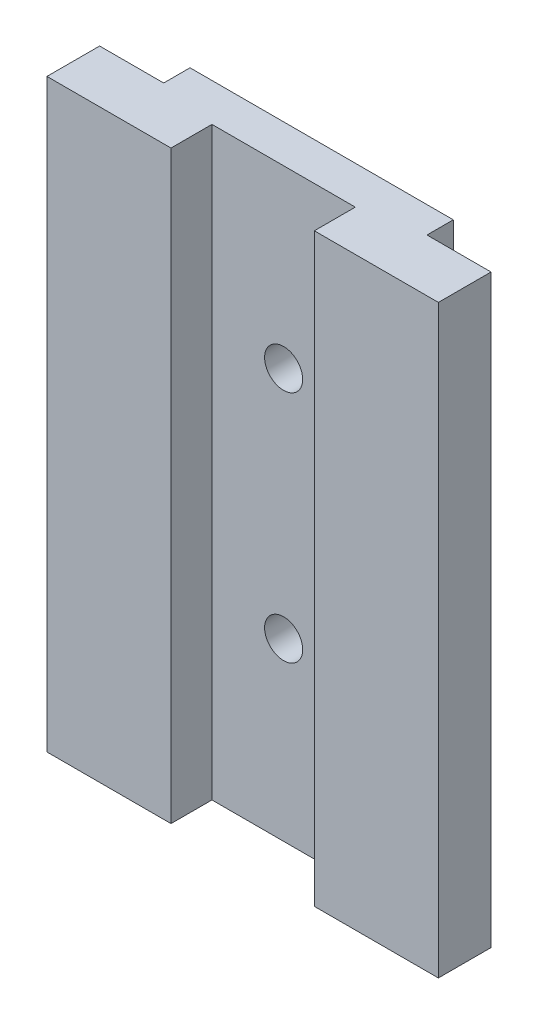
ISO-10303-21;
HEADER;
FILE_DESCRIPTION(('STEP AP214'),'2;1');
FILE_NAME('part.step','',(''),(''),'','','');
FILE_SCHEMA(('AUTOMOTIVE_DESIGN { 1 0 10303 214 1 1 1 1 }'));
ENDSEC;
DATA;
#1=APPLICATION_CONTEXT('core data for automotive mechanical design processes');
#2=APPLICATION_PROTOCOL_DEFINITION('international standard','automotive_design',2000,#1);
#3=PRODUCT_CONTEXT('',#1,'mechanical');
#4=PRODUCT('Part','Part','',(#3));
#5=PRODUCT_RELATED_PRODUCT_CATEGORY('part','',(#4));
#6=PRODUCT_DEFINITION_FORMATION('','',#4);
#7=PRODUCT_DEFINITION_CONTEXT('part definition',#1,'design');
#8=PRODUCT_DEFINITION('design','',#6,#7);
#9=PRODUCT_DEFINITION_SHAPE('','',#8);
#10=(LENGTH_UNIT() NAMED_UNIT(*) SI_UNIT(.MILLI.,.METRE.));
#11=(NAMED_UNIT(*) PLANE_ANGLE_UNIT() SI_UNIT($,.RADIAN.));
#12=(NAMED_UNIT(*) SI_UNIT($,.STERADIAN.) SOLID_ANGLE_UNIT());
#13=UNCERTAINTY_MEASURE_WITH_UNIT(LENGTH_MEASURE(1.E-05),#10,'distance_accuracy_value','');
#14=(GEOMETRIC_REPRESENTATION_CONTEXT(3) GLOBAL_UNCERTAINTY_ASSIGNED_CONTEXT((#13)) GLOBAL_UNIT_ASSIGNED_CONTEXT((#10,
#11,#12)) REPRESENTATION_CONTEXT('',''));
#15=CARTESIAN_POINT('',(0.,0.,0.));
#16=DIRECTION('',(0.,0.,1.));
#17=DIRECTION('',(1.,0.,0.));
#18=AXIS2_PLACEMENT_3D('',#15,#16,#17);
#19=CARTESIAN_POINT('',(-11.43,50.8,0.));
#20=DIRECTION('',(1.,0.,0.));
#21=DIRECTION('',(0.,0.,-1.));
#22=AXIS2_PLACEMENT_3D('',#19,#20,#21);
#23=PLANE('',#22);
#24=DIRECTION('',(0.,0.,1.));
#25=VECTOR('',#24,1.);
#26=CARTESIAN_POINT('',(-11.43,0.,0.));
#27=LINE('',#26,#25);
#28=CARTESIAN_POINT('',(-11.43,0.,0.));
#29=VERTEX_POINT('',#28);
#30=CARTESIAN_POINT('',(-11.43,0.,2.286));
#31=VERTEX_POINT('',#30);
#32=EDGE_CURVE('E160',#29,#31,#27,.T.);
#33=ORIENTED_EDGE('',*,*,#32,.T.);
#34=DIRECTION('',(0.,-1.,0.));
#35=VECTOR('',#34,1.);
#36=CARTESIAN_POINT('',(-11.43,50.8,2.286));
#37=LINE('',#36,#35);
#38=CARTESIAN_POINT('',(-11.43,50.8,2.286));
#39=VERTEX_POINT('',#38);
#40=EDGE_CURVE('E203',#39,#31,#37,.T.);
#41=ORIENTED_EDGE('',*,*,#40,.F.);
#42=DIRECTION('',(0.,0.,1.));
#43=VECTOR('',#42,1.);
#44=CARTESIAN_POINT('',(-11.43,50.8,0.));
#45=LINE('',#44,#43);
#46=CARTESIAN_POINT('',(-11.43,50.8,0.));
#47=VERTEX_POINT('',#46);
#48=EDGE_CURVE('E108',#47,#39,#45,.T.);
#49=ORIENTED_EDGE('',*,*,#48,.F.);
#50=DIRECTION('',(0.,-1.,0.));
#51=VECTOR('',#50,1.);
#52=CARTESIAN_POINT('',(-11.43,50.8,0.));
#53=LINE('',#52,#51);
#54=EDGE_CURVE('E206',#47,#29,#53,.T.);
#55=ORIENTED_EDGE('',*,*,#54,.T.);
#56=EDGE_LOOP('',(#33,#41,#49,#55));
#57=FACE_BOUND('',#56,.T.);
#58=ADVANCED_FACE('F34',(#57),#23,.F.);
#59=CARTESIAN_POINT('',(-11.43,50.8,2.286));
#60=DIRECTION('',(0.,0.,1.));
#61=DIRECTION('',(1.,0.,0.));
#62=AXIS2_PLACEMENT_3D('',#59,#60,#61);
#63=PLANE('',#62);
#64=DIRECTION('',(-1.,0.,0.));
#65=VECTOR('',#64,1.);
#66=CARTESIAN_POINT('',(-11.43,0.,2.286));
#67=LINE('',#66,#65);
#68=CARTESIAN_POINT('',(-16.9926,0.,2.286));
#69=VERTEX_POINT('',#68);
#70=EDGE_CURVE('E162',#31,#69,#67,.T.);
#71=ORIENTED_EDGE('',*,*,#70,.T.);
#72=DIRECTION('',(0.,-1.,0.));
#73=VECTOR('',#72,1.);
#74=CARTESIAN_POINT('',(-16.9926,50.8,2.286));
#75=LINE('',#74,#73);
#76=CARTESIAN_POINT('',(-16.9926,50.8,2.286));
#77=VERTEX_POINT('',#76);
#78=EDGE_CURVE('E200',#77,#69,#75,.T.);
#79=ORIENTED_EDGE('',*,*,#78,.F.);
#80=DIRECTION('',(-1.,0.,0.));
#81=VECTOR('',#80,1.);
#82=CARTESIAN_POINT('',(-11.43,50.8,2.286));
#83=LINE('',#82,#81);
#84=EDGE_CURVE('E284',#39,#77,#83,.T.);
#85=ORIENTED_EDGE('',*,*,#84,.F.);
#86=ORIENTED_EDGE('',*,*,#40,.T.);
#87=EDGE_LOOP('',(#71,#79,#85,#86));
#88=FACE_BOUND('',#87,.T.);
#89=ADVANCED_FACE('F238',(#88),#63,.F.);
#90=CARTESIAN_POINT('',(-16.9926,50.8,2.286));
#91=DIRECTION('',(1.,0.,0.));
#92=DIRECTION('',(0.,0.,-1.));
#93=AXIS2_PLACEMENT_3D('',#90,#91,#92);
#94=PLANE('',#93);
#95=DIRECTION('',(0.,0.,1.));
#96=VECTOR('',#95,1.);
#97=CARTESIAN_POINT('',(-16.9926,0.,2.286));
#98=LINE('',#97,#96);
#99=CARTESIAN_POINT('',(-16.9926,0.,6.858));
#100=VERTEX_POINT('',#99);
#101=EDGE_CURVE('E165',#69,#100,#98,.T.);
#102=ORIENTED_EDGE('',*,*,#101,.T.);
#103=DIRECTION('',(0.,-1.,0.));
#104=VECTOR('',#103,1.);
#105=CARTESIAN_POINT('',(-16.9926,50.8,6.858));
#106=LINE('',#105,#104);
#107=CARTESIAN_POINT('',(-16.9926,50.8,6.858));
#108=VERTEX_POINT('',#107);
#109=EDGE_CURVE('E197',#108,#100,#106,.T.);
#110=ORIENTED_EDGE('',*,*,#109,.F.);
#111=DIRECTION('',(0.,0.,1.));
#112=VECTOR('',#111,1.);
#113=CARTESIAN_POINT('',(-16.9926,50.8,2.286));
#114=LINE('',#113,#112);
#115=EDGE_CURVE('E286',#77,#108,#114,.T.);
#116=ORIENTED_EDGE('',*,*,#115,.F.);
#117=ORIENTED_EDGE('',*,*,#78,.T.);
#118=EDGE_LOOP('',(#102,#110,#116,#117));
#119=FACE_BOUND('',#118,.T.);
#120=ADVANCED_FACE('F243',(#119),#94,.F.);
#121=CARTESIAN_POINT('',(-16.9926,50.8,6.858));
#122=DIRECTION('',(0.,0.,-1.));
#123=DIRECTION('',(-1.,0.,0.));
#124=AXIS2_PLACEMENT_3D('',#121,#122,#123);
#125=PLANE('',#124);
#126=DIRECTION('',(1.,0.,0.));
#127=VECTOR('',#126,1.);
#128=CARTESIAN_POINT('',(-16.9926,0.,6.858));
#129=LINE('',#128,#127);
#130=CARTESIAN_POINT('',(-6.223,0.,6.858));
#131=VERTEX_POINT('',#130);
#132=EDGE_CURVE('E167',#100,#131,#129,.T.);
#133=ORIENTED_EDGE('',*,*,#132,.T.);
#134=DIRECTION('',(0.,-1.,0.));
#135=VECTOR('',#134,1.);
#136=CARTESIAN_POINT('',(-6.223,50.8,6.858));
#137=LINE('',#136,#135);
#138=CARTESIAN_POINT('',(-6.223,50.8,6.858));
#139=VERTEX_POINT('',#138);
#140=EDGE_CURVE('E194',#139,#131,#137,.T.);
#141=ORIENTED_EDGE('',*,*,#140,.F.);
#142=DIRECTION('',(1.,0.,0.));
#143=VECTOR('',#142,1.);
#144=CARTESIAN_POINT('',(-16.9926,50.8,6.858));
#145=LINE('',#144,#143);
#146=EDGE_CURVE('E288',#108,#139,#145,.T.);
#147=ORIENTED_EDGE('',*,*,#146,.F.);
#148=ORIENTED_EDGE('',*,*,#109,.T.);
#149=EDGE_LOOP('',(#133,#141,#147,#148));
#150=FACE_BOUND('',#149,.T.);
#151=ADVANCED_FACE('F321',(#150),#125,.F.);
#152=CARTESIAN_POINT('',(-6.223,50.8,6.858));
#153=DIRECTION('',(-1.,0.,0.));
#154=DIRECTION('',(0.,0.,1.));
#155=AXIS2_PLACEMENT_3D('',#152,#153,#154);
#156=PLANE('',#155);
#157=DIRECTION('',(0.,0.,-1.));
#158=VECTOR('',#157,1.);
#159=CARTESIAN_POINT('',(-6.223,0.,6.858));
#160=LINE('',#159,#158);
#161=CARTESIAN_POINT('',(-6.223,0.,3.302));
#162=VERTEX_POINT('',#161);
#163=EDGE_CURVE('E169',#131,#162,#160,.T.);
#164=ORIENTED_EDGE('',*,*,#163,.T.);
#165=DIRECTION('',(0.,-1.,0.));
#166=VECTOR('',#165,1.);
#167=CARTESIAN_POINT('',(-6.223,50.8,3.302));
#168=LINE('',#167,#166);
#169=CARTESIAN_POINT('',(-6.223,50.8,3.302));
#170=VERTEX_POINT('',#169);
#171=EDGE_CURVE('E191',#170,#162,#168,.T.);
#172=ORIENTED_EDGE('',*,*,#171,.F.);
#173=DIRECTION('',(0.,0.,-1.));
#174=VECTOR('',#173,1.);
#175=CARTESIAN_POINT('',(-6.223,50.8,6.858));
#176=LINE('',#175,#174);
#177=EDGE_CURVE('E294',#139,#170,#176,.T.);
#178=ORIENTED_EDGE('',*,*,#177,.F.);
#179=ORIENTED_EDGE('',*,*,#140,.T.);
#180=EDGE_LOOP('',(#164,#172,#178,#179));
#181=FACE_BOUND('',#180,.T.);
#182=ADVANCED_FACE('F317',(#181),#156,.F.);
#183=CARTESIAN_POINT('',(-6.223,50.8,3.302));
#184=DIRECTION('',(0.,0.,-1.));
#185=DIRECTION('',(-1.,0.,0.));
#186=AXIS2_PLACEMENT_3D('',#183,#184,#185);
#187=PLANE('',#186);
#188=CARTESIAN_POINT('',(0.,35.56,3.302));
#189=DIRECTION('',(0.,0.,-1.));
#190=DIRECTION('',(-1.,0.,0.));
#191=AXIS2_PLACEMENT_3D('',#188,#189,#190);
#192=CIRCLE('',#191,1.651);
#193=CARTESIAN_POINT('',(-1.651,35.56,3.302));
#194=VERTEX_POINT('',#193);
#195=EDGE_CURVE('E483',#194,#194,#192,.T.);
#196=ORIENTED_EDGE('',*,*,#195,.T.);
#197=EDGE_LOOP('',(#196));
#198=FACE_BOUND('',#197,.T.);
#199=CARTESIAN_POINT('',(0.,15.24,3.302));
#200=DIRECTION('',(0.,0.,-1.));
#201=DIRECTION('',(-1.,0.,0.));
#202=AXIS2_PLACEMENT_3D('',#199,#200,#201);
#203=CIRCLE('',#202,1.651);
#204=CARTESIAN_POINT('',(-1.651,15.24,3.302));
#205=VERTEX_POINT('',#204);
#206=EDGE_CURVE('E163',#205,#205,#203,.T.);
#207=ORIENTED_EDGE('',*,*,#206,.T.);
#208=EDGE_LOOP('',(#207));
#209=FACE_BOUND('',#208,.T.);
#210=DIRECTION('',(1.,0.,0.));
#211=VECTOR('',#210,1.);
#212=CARTESIAN_POINT('',(-6.223,0.,3.302));
#213=LINE('',#212,#211);
#214=CARTESIAN_POINT('',(6.223,0.,3.302));
#215=VERTEX_POINT('',#214);
#216=EDGE_CURVE('E171',#162,#215,#213,.T.);
#217=ORIENTED_EDGE('',*,*,#216,.T.);
#218=DIRECTION('',(0.,-1.,0.));
#219=VECTOR('',#218,1.);
#220=CARTESIAN_POINT('',(6.223,50.8,3.302));
#221=LINE('',#220,#219);
#222=CARTESIAN_POINT('',(6.223,50.8,3.302));
#223=VERTEX_POINT('',#222);
#224=EDGE_CURVE('E188',#223,#215,#221,.T.);
#225=ORIENTED_EDGE('',*,*,#224,.F.);
#226=DIRECTION('',(1.,0.,0.));
#227=VECTOR('',#226,1.);
#228=CARTESIAN_POINT('',(-6.223,50.8,3.302));
#229=LINE('',#228,#227);
#230=EDGE_CURVE('E296',#170,#223,#229,.T.);
#231=ORIENTED_EDGE('',*,*,#230,.F.);
#232=ORIENTED_EDGE('',*,*,#171,.T.);
#233=EDGE_LOOP('',(#217,#225,#231,#232));
#234=FACE_BOUND('',#233,.T.);
#235=ADVANCED_FACE('F313',(#198,#209,#234),#187,.F.);
#236=CARTESIAN_POINT('',(6.223,50.8,6.858));
#237=DIRECTION('',(1.,0.,0.));
#238=DIRECTION('',(0.,0.,-1.));
#239=AXIS2_PLACEMENT_3D('',#236,#237,#238);
#240=PLANE('',#239);
#241=DIRECTION('',(0.,0.,1.));
#242=VECTOR('',#241,1.);
#243=CARTESIAN_POINT('',(6.223,0.,6.858));
#244=LINE('',#243,#242);
#245=CARTESIAN_POINT('',(6.223,0.,6.858));
#246=VERTEX_POINT('',#245);
#247=EDGE_CURVE('E173',#215,#246,#244,.T.);
#248=ORIENTED_EDGE('',*,*,#247,.T.);
#249=DIRECTION('',(0.,-1.,0.));
#250=VECTOR('',#249,1.);
#251=CARTESIAN_POINT('',(6.223,50.8,6.858));
#252=LINE('',#251,#250);
#253=CARTESIAN_POINT('',(6.223,50.8,6.858));
#254=VERTEX_POINT('',#253);
#255=EDGE_CURVE('E185',#254,#246,#252,.T.);
#256=ORIENTED_EDGE('',*,*,#255,.F.);
#257=DIRECTION('',(0.,0.,1.));
#258=VECTOR('',#257,1.);
#259=CARTESIAN_POINT('',(6.223,50.8,6.858));
#260=LINE('',#259,#258);
#261=EDGE_CURVE('E298',#223,#254,#260,.T.);
#262=ORIENTED_EDGE('',*,*,#261,.F.);
#263=ORIENTED_EDGE('',*,*,#224,.T.);
#264=EDGE_LOOP('',(#248,#256,#262,#263));
#265=FACE_BOUND('',#264,.T.);
#266=ADVANCED_FACE('F304',(#265),#240,.F.);
#267=CARTESIAN_POINT('',(16.9926,50.8,6.858));
#268=DIRECTION('',(0.,0.,-1.));
#269=DIRECTION('',(-1.,0.,0.));
#270=AXIS2_PLACEMENT_3D('',#267,#268,#269);
#271=PLANE('',#270);
#272=DIRECTION('',(1.,0.,0.));
#273=VECTOR('',#272,1.);
#274=CARTESIAN_POINT('',(16.9926,0.,6.858));
#275=LINE('',#274,#273);
#276=CARTESIAN_POINT('',(16.9926,0.,6.858));
#277=VERTEX_POINT('',#276);
#278=EDGE_CURVE('E175',#246,#277,#275,.T.);
#279=ORIENTED_EDGE('',*,*,#278,.T.);
#280=DIRECTION('',(0.,-1.,0.));
#281=VECTOR('',#280,1.);
#282=CARTESIAN_POINT('',(16.9926,50.8,6.858));
#283=LINE('',#282,#281);
#284=CARTESIAN_POINT('',(16.9926,50.8,6.858));
#285=VERTEX_POINT('',#284);
#286=EDGE_CURVE('E149',#285,#277,#283,.T.);
#287=ORIENTED_EDGE('',*,*,#286,.F.);
#288=DIRECTION('',(1.,0.,0.));
#289=VECTOR('',#288,1.);
#290=CARTESIAN_POINT('',(16.9926,50.8,6.858));
#291=LINE('',#290,#289);
#292=EDGE_CURVE('E140',#254,#285,#291,.T.);
#293=ORIENTED_EDGE('',*,*,#292,.F.);
#294=ORIENTED_EDGE('',*,*,#255,.T.);
#295=EDGE_LOOP('',(#279,#287,#293,#294));
#296=FACE_BOUND('',#295,.T.);
#297=ADVANCED_FACE('F308',(#296),#271,.F.);
#298=CARTESIAN_POINT('',(16.9926,50.8,2.286));
#299=DIRECTION('',(-1.,0.,0.));
#300=DIRECTION('',(0.,0.,1.));
#301=AXIS2_PLACEMENT_3D('',#298,#299,#300);
#302=PLANE('',#301);
#303=DIRECTION('',(0.,0.,-1.));
#304=VECTOR('',#303,1.);
#305=CARTESIAN_POINT('',(16.9926,0.,2.286));
#306=LINE('',#305,#304);
#307=CARTESIAN_POINT('',(16.9926,0.,2.286));
#308=VERTEX_POINT('',#307);
#309=EDGE_CURVE('E148',#277,#308,#306,.T.);
#310=ORIENTED_EDGE('',*,*,#309,.T.);
#311=DIRECTION('',(0.,-1.,0.));
#312=VECTOR('',#311,1.);
#313=CARTESIAN_POINT('',(16.9926,50.8,2.286));
#314=LINE('',#313,#312);
#315=CARTESIAN_POINT('',(16.9926,50.8,2.286));
#316=VERTEX_POINT('',#315);
#317=EDGE_CURVE('E145',#316,#308,#314,.T.);
#318=ORIENTED_EDGE('',*,*,#317,.F.);
#319=DIRECTION('',(0.,0.,-1.));
#320=VECTOR('',#319,1.);
#321=CARTESIAN_POINT('',(16.9926,50.8,2.286));
#322=LINE('',#321,#320);
#323=EDGE_CURVE('E134',#285,#316,#322,.T.);
#324=ORIENTED_EDGE('',*,*,#323,.F.);
#325=ORIENTED_EDGE('',*,*,#286,.T.);
#326=EDGE_LOOP('',(#310,#318,#324,#325));
#327=FACE_BOUND('',#326,.T.);
#328=ADVANCED_FACE('F146',(#327),#302,.F.);
#329=CARTESIAN_POINT('',(11.43,50.8,2.286));
#330=DIRECTION('',(0.,0.,1.));
#331=DIRECTION('',(1.,0.,0.));
#332=AXIS2_PLACEMENT_3D('',#329,#330,#331);
#333=PLANE('',#332);
#334=DIRECTION('',(-1.,0.,0.));
#335=VECTOR('',#334,1.);
#336=CARTESIAN_POINT('',(11.43,0.,2.286));
#337=LINE('',#336,#335);
#338=CARTESIAN_POINT('',(11.43,0.,2.286));
#339=VERTEX_POINT('',#338);
#340=EDGE_CURVE('E93',#308,#339,#337,.T.);
#341=ORIENTED_EDGE('',*,*,#340,.T.);
#342=DIRECTION('',(0.,-1.,0.));
#343=VECTOR('',#342,1.);
#344=CARTESIAN_POINT('',(11.43,50.8,2.286));
#345=LINE('',#344,#343);
#346=CARTESIAN_POINT('',(11.43,50.8,2.286));
#347=VERTEX_POINT('',#346);
#348=EDGE_CURVE('E150',#347,#339,#345,.T.);
#349=ORIENTED_EDGE('',*,*,#348,.F.);
#350=DIRECTION('',(-1.,0.,0.));
#351=VECTOR('',#350,1.);
#352=CARTESIAN_POINT('',(11.43,50.8,2.286));
#353=LINE('',#352,#351);
#354=EDGE_CURVE('E138',#316,#347,#353,.T.);
#355=ORIENTED_EDGE('',*,*,#354,.F.);
#356=ORIENTED_EDGE('',*,*,#317,.T.);
#357=EDGE_LOOP('',(#341,#349,#355,#356));
#358=FACE_BOUND('',#357,.T.);
#359=ADVANCED_FACE('F152',(#358),#333,.F.);
#360=CARTESIAN_POINT('',(11.43,50.8,0.));
#361=DIRECTION('',(-1.,0.,0.));
#362=DIRECTION('',(0.,0.,1.));
#363=AXIS2_PLACEMENT_3D('',#360,#361,#362);
#364=PLANE('',#363);
#365=DIRECTION('',(0.,0.,-1.));
#366=VECTOR('',#365,1.);
#367=CARTESIAN_POINT('',(11.43,0.,0.));
#368=LINE('',#367,#366);
#369=CARTESIAN_POINT('',(11.43,0.,0.));
#370=VERTEX_POINT('',#369);
#371=EDGE_CURVE('E100',#339,#370,#368,.T.);
#372=ORIENTED_EDGE('',*,*,#371,.T.);
#373=DIRECTION('',(0.,-1.,0.));
#374=VECTOR('',#373,1.);
#375=CARTESIAN_POINT('',(11.43,50.8,0.));
#376=LINE('',#375,#374);
#377=CARTESIAN_POINT('',(11.43,50.8,0.));
#378=VERTEX_POINT('',#377);
#379=EDGE_CURVE('E156',#378,#370,#376,.T.);
#380=ORIENTED_EDGE('',*,*,#379,.F.);
#381=DIRECTION('',(0.,0.,-1.));
#382=VECTOR('',#381,1.);
#383=CARTESIAN_POINT('',(11.43,50.8,0.));
#384=LINE('',#383,#382);
#385=EDGE_CURVE('E154',#347,#378,#384,.T.);
#386=ORIENTED_EDGE('',*,*,#385,.F.);
#387=ORIENTED_EDGE('',*,*,#348,.T.);
#388=EDGE_LOOP('',(#372,#380,#386,#387));
#389=FACE_BOUND('',#388,.T.);
#390=ADVANCED_FACE('F274',(#389),#364,.F.);
#391=CARTESIAN_POINT('',(0.,50.8,0.));
#392=DIRECTION('',(0.,0.,1.));
#393=DIRECTION('',(1.,0.,0.));
#394=AXIS2_PLACEMENT_3D('',#391,#392,#393);
#395=PLANE('',#394);
#396=CARTESIAN_POINT('',(0.,35.56,0.));
#397=DIRECTION('',(0.,0.,1.));
#398=DIRECTION('',(1.,0.,0.));
#399=AXIS2_PLACEMENT_3D('',#396,#397,#398);
#400=CIRCLE('',#399,2.921);
#401=CARTESIAN_POINT('',(2.921,35.56,0.));
#402=VERTEX_POINT('',#401);
#403=EDGE_CURVE('E217',#402,#402,#400,.F.);
#404=ORIENTED_EDGE('',*,*,#403,.F.);
#405=EDGE_LOOP('',(#404));
#406=FACE_BOUND('',#405,.T.);
#407=CARTESIAN_POINT('',(0.,15.24,0.));
#408=DIRECTION('',(0.,0.,1.));
#409=DIRECTION('',(1.,0.,0.));
#410=AXIS2_PLACEMENT_3D('',#407,#408,#409);
#411=CIRCLE('',#410,2.921);
#412=CARTESIAN_POINT('',(2.921,15.24,0.));
#413=VERTEX_POINT('',#412);
#414=EDGE_CURVE('E208',#413,#413,#411,.F.);
#415=ORIENTED_EDGE('',*,*,#414,.F.);
#416=EDGE_LOOP('',(#415));
#417=FACE_BOUND('',#416,.T.);
#418=DIRECTION('',(-1.,0.,0.));
#419=VECTOR('',#418,1.);
#420=CARTESIAN_POINT('',(0.,0.,0.));
#421=LINE('',#420,#419);
#422=EDGE_CURVE('E180',#370,#29,#421,.T.);
#423=ORIENTED_EDGE('',*,*,#422,.T.);
#424=ORIENTED_EDGE('',*,*,#54,.F.);
#425=DIRECTION('',(-1.,0.,0.));
#426=VECTOR('',#425,1.);
#427=CARTESIAN_POINT('',(0.,50.8,0.));
#428=LINE('',#427,#426);
#429=EDGE_CURVE('E51',#378,#47,#428,.T.);
#430=ORIENTED_EDGE('',*,*,#429,.F.);
#431=ORIENTED_EDGE('',*,*,#379,.T.);
#432=EDGE_LOOP('',(#423,#424,#430,#431));
#433=FACE_BOUND('',#432,.T.);
#434=ADVANCED_FACE('F272',(#406,#417,#433),#395,.F.);
#435=CARTESIAN_POINT('',(0.,50.8,0.));
#436=DIRECTION('',(0.,1.,0.));
#437=DIRECTION('',(0.,0.,1.));
#438=AXIS2_PLACEMENT_3D('',#435,#436,#437);
#439=PLANE('',#438);
#440=ORIENTED_EDGE('',*,*,#429,.T.);
#441=ORIENTED_EDGE('',*,*,#48,.T.);
#442=ORIENTED_EDGE('',*,*,#84,.T.);
#443=ORIENTED_EDGE('',*,*,#115,.T.);
#444=ORIENTED_EDGE('',*,*,#146,.T.);
#445=ORIENTED_EDGE('',*,*,#177,.T.);
#446=ORIENTED_EDGE('',*,*,#230,.T.);
#447=ORIENTED_EDGE('',*,*,#261,.T.);
#448=ORIENTED_EDGE('',*,*,#292,.T.);
#449=ORIENTED_EDGE('',*,*,#323,.T.);
#450=ORIENTED_EDGE('',*,*,#354,.T.);
#451=ORIENTED_EDGE('',*,*,#385,.T.);
#452=EDGE_LOOP('',(#440,#441,#442,#443,#444,#445,#446,#447,#448,#449,#450,#451));
#453=FACE_BOUND('',#452,.T.);
#454=ADVANCED_FACE('F136',(#453),#439,.T.);
#455=CARTESIAN_POINT('',(0.,0.,0.));
#456=DIRECTION('',(0.,1.,0.));
#457=DIRECTION('',(0.,0.,1.));
#458=AXIS2_PLACEMENT_3D('',#455,#456,#457);
#459=PLANE('',#458);
#460=ORIENTED_EDGE('',*,*,#32,.F.);
#461=ORIENTED_EDGE('',*,*,#422,.F.);
#462=ORIENTED_EDGE('',*,*,#371,.F.);
#463=ORIENTED_EDGE('',*,*,#340,.F.);
#464=ORIENTED_EDGE('',*,*,#309,.F.);
#465=ORIENTED_EDGE('',*,*,#278,.F.);
#466=ORIENTED_EDGE('',*,*,#247,.F.);
#467=ORIENTED_EDGE('',*,*,#216,.F.);
#468=ORIENTED_EDGE('',*,*,#163,.F.);
#469=ORIENTED_EDGE('',*,*,#132,.F.);
#470=ORIENTED_EDGE('',*,*,#101,.F.);
#471=ORIENTED_EDGE('',*,*,#70,.F.);
#472=EDGE_LOOP('',(#460,#461,#462,#463,#464,#465,#466,#467,#468,#469,#470,#471));
#473=FACE_BOUND('',#472,.T.);
#474=ADVANCED_FACE('F268',(#473),#459,.F.);
#475=CARTESIAN_POINT('',(0.,15.24,-4.445));
#476=DIRECTION('',(0.,0.,1.));
#477=DIRECTION('',(1.,0.,0.));
#478=AXIS2_PLACEMENT_3D('',#475,#476,#477);
#479=CYLINDRICAL_SURFACE('',#478,2.921);
#480=CARTESIAN_POINT('',(0.,15.24,-4.191));
#481=DIRECTION('',(0.,0.,-1.));
#482=DIRECTION('',(-1.,0.,0.));
#483=AXIS2_PLACEMENT_3D('',#480,#481,#482);
#484=CIRCLE('',#483,2.921);
#485=CARTESIAN_POINT('',(-2.921,15.24,-4.191));
#486=VERTEX_POINT('',#485);
#487=EDGE_CURVE('E214',#486,#486,#484,.F.);
#488=ORIENTED_EDGE('',*,*,#487,.T.);
#489=EDGE_LOOP('',(#488));
#490=FACE_BOUND('',#489,.T.);
#491=ORIENTED_EDGE('',*,*,#414,.T.);
#492=EDGE_LOOP('',(#491));
#493=FACE_BOUND('',#492,.T.);
#494=ADVANCED_FACE('F258',(#490,#493),#479,.T.);
#495=CARTESIAN_POINT('',(0.,15.24,-4.445));
#496=DIRECTION('',(0.,0.,-1.));
#497=DIRECTION('',(-1.,0.,0.));
#498=AXIS2_PLACEMENT_3D('',#495,#496,#497);
#499=PLANE('',#498);
#500=CARTESIAN_POINT('',(0.,15.24,-4.445));
#501=DIRECTION('',(0.,0.,-1.));
#502=DIRECTION('',(-1.,0.,0.));
#503=AXIS2_PLACEMENT_3D('',#500,#501,#502);
#504=CIRCLE('',#503,1.651);
#505=CARTESIAN_POINT('',(-1.651,15.24,-4.445));
#506=VERTEX_POINT('',#505);
#507=EDGE_CURVE('E487',#506,#506,#504,.T.);
#508=ORIENTED_EDGE('',*,*,#507,.F.);
#509=EDGE_LOOP('',(#508));
#510=FACE_BOUND('',#509,.T.);
#511=CARTESIAN_POINT('',(0.,15.24,-4.445));
#512=DIRECTION('',(0.,0.,-1.));
#513=DIRECTION('',(-1.,0.,0.));
#514=AXIS2_PLACEMENT_3D('',#511,#512,#513);
#515=CIRCLE('',#514,2.667);
#516=CARTESIAN_POINT('',(-2.667,15.24,-4.445));
#517=VERTEX_POINT('',#516);
#518=EDGE_CURVE('E211',#517,#517,#515,.T.);
#519=ORIENTED_EDGE('',*,*,#518,.T.);
#520=EDGE_LOOP('',(#519));
#521=FACE_BOUND('',#520,.T.);
#522=ADVANCED_FACE('F250',(#510,#521),#499,.T.);
#523=CARTESIAN_POINT('',(0.,15.24,-4.191));
#524=DIRECTION('',(0.,0.,-1.));
#525=DIRECTION('',(-1.,0.,0.));
#526=AXIS2_PLACEMENT_3D('',#523,#524,#525);
#527=TOROIDAL_SURFACE('',#526,2.667,0.254);
#528=ORIENTED_EDGE('',*,*,#487,.F.);
#529=EDGE_LOOP('',(#528));
#530=FACE_BOUND('',#529,.T.);
#531=ORIENTED_EDGE('',*,*,#518,.F.);
#532=EDGE_LOOP('',(#531));
#533=FACE_BOUND('',#532,.T.);
#534=ADVANCED_FACE('F247',(#530,#533),#527,.T.);
#535=CARTESIAN_POINT('',(0.,15.24,6.858));
#536=DIRECTION('',(0.,0.,-1.));
#537=DIRECTION('',(-1.,0.,0.));
#538=AXIS2_PLACEMENT_3D('',#535,#536,#537);
#539=CYLINDRICAL_SURFACE('',#538,1.651);
#540=CARTESIAN_POINT('',(-1.651,15.24,-4.445));
#541=CARTESIAN_POINT('',(-1.651,15.24,-4.36430208333333));
#542=CARTESIAN_POINT('',(-1.651,15.24,-4.28360416666666));
#543=CARTESIAN_POINT('',(-1.651,15.24,-4.12220833333333));
#544=CARTESIAN_POINT('',(-1.651,15.24,-4.04151041666666));
#545=CARTESIAN_POINT('',(-1.651,15.24,-3.88011458333333));
#546=CARTESIAN_POINT('',(-1.651,15.24,-3.79941666666666));
#547=CARTESIAN_POINT('',(-1.651,15.24,-3.63802083333333));
#548=CARTESIAN_POINT('',(-1.651,15.24,-3.55732291666666));
#549=CARTESIAN_POINT('',(-1.651,15.24,-3.39592708333333));
#550=CARTESIAN_POINT('',(-1.651,15.24,-3.31522916666666));
#551=CARTESIAN_POINT('',(-1.651,15.24,-3.15383333333333));
#552=CARTESIAN_POINT('',(-1.651,15.24,-3.07313541666666));
#553=CARTESIAN_POINT('',(-1.651,15.24,-2.91173958333333));
#554=CARTESIAN_POINT('',(-1.651,15.24,-2.83104166666666));
#555=CARTESIAN_POINT('',(-1.651,15.24,-2.66964583333333));
#556=CARTESIAN_POINT('',(-1.651,15.24,-2.58894791666666));
#557=CARTESIAN_POINT('',(-1.651,15.24,-2.42755208333333));
#558=CARTESIAN_POINT('',(-1.651,15.24,-2.34685416666666));
#559=CARTESIAN_POINT('',(-1.651,15.24,-2.18545833333333));
#560=CARTESIAN_POINT('',(-1.651,15.24,-2.10476041666666));
#561=CARTESIAN_POINT('',(-1.651,15.24,-1.94336458333333));
#562=CARTESIAN_POINT('',(-1.651,15.24,-1.86266666666666));
#563=CARTESIAN_POINT('',(-1.651,15.24,-1.70127083333333));
#564=CARTESIAN_POINT('',(-1.651,15.24,-1.62057291666666));
#565=CARTESIAN_POINT('',(-1.651,15.24,-1.45917708333333));
#566=CARTESIAN_POINT('',(-1.651,15.24,-1.37847916666666));
#567=CARTESIAN_POINT('',(-1.651,15.24,-1.21708333333333));
#568=CARTESIAN_POINT('',(-1.651,15.24,-1.13638541666666));
#569=CARTESIAN_POINT('',(-1.651,15.24,-0.974989583333331));
#570=CARTESIAN_POINT('',(-1.651,15.24,-0.894291666666665));
#571=CARTESIAN_POINT('',(-1.651,15.24,-0.732895833333332));
#572=CARTESIAN_POINT('',(-1.651,15.24,-0.652197916666665));
#573=CARTESIAN_POINT('',(-1.651,15.24,-0.490802083333332));
#574=CARTESIAN_POINT('',(-1.651,15.24,-0.410104166666665));
#575=CARTESIAN_POINT('',(-1.651,15.24,-0.248708333333331));
#576=CARTESIAN_POINT('',(-1.651,15.24,-0.168010416666665));
#577=CARTESIAN_POINT('',(-1.651,15.24,-0.00661458333333128));
#578=CARTESIAN_POINT('',(-1.651,15.24,0.0740833333333354));
#579=CARTESIAN_POINT('',(-1.651,15.24,0.235479166666669));
#580=CARTESIAN_POINT('',(-1.651,15.24,0.316177083333336));
#581=CARTESIAN_POINT('',(-1.651,15.24,0.477572916666669));
#582=CARTESIAN_POINT('',(-1.651,15.24,0.558270833333335));
#583=CARTESIAN_POINT('',(-1.651,15.24,0.719666666666668));
#584=CARTESIAN_POINT('',(-1.651,15.24,0.800364583333335));
#585=CARTESIAN_POINT('',(-1.651,15.24,0.961760416666668));
#586=CARTESIAN_POINT('',(-1.651,15.24,1.04245833333334));
#587=CARTESIAN_POINT('',(-1.651,15.24,1.20385416666667));
#588=CARTESIAN_POINT('',(-1.651,15.24,1.28455208333334));
#589=CARTESIAN_POINT('',(-1.651,15.24,1.44594791666667));
#590=CARTESIAN_POINT('',(-1.651,15.24,1.52664583333334));
#591=CARTESIAN_POINT('',(-1.651,15.24,1.68804166666667));
#592=CARTESIAN_POINT('',(-1.651,15.24,1.76873958333334));
#593=CARTESIAN_POINT('',(-1.651,15.24,1.93013541666667));
#594=CARTESIAN_POINT('',(-1.651,15.24,2.01083333333334));
#595=CARTESIAN_POINT('',(-1.651,15.24,2.17222916666667));
#596=CARTESIAN_POINT('',(-1.651,15.24,2.25292708333334));
#597=CARTESIAN_POINT('',(-1.651,15.24,2.41432291666667));
#598=CARTESIAN_POINT('',(-1.651,15.24,2.49502083333333));
#599=CARTESIAN_POINT('',(-1.651,15.24,2.65641666666667));
#600=CARTESIAN_POINT('',(-1.651,15.24,2.73711458333334));
#601=CARTESIAN_POINT('',(-1.651,15.24,2.89851041666667));
#602=CARTESIAN_POINT('',(-1.651,15.24,2.97920833333334));
#603=CARTESIAN_POINT('',(-1.651,15.24,3.14060416666667));
#604=CARTESIAN_POINT('',(-1.651,15.24,3.22130208333333));
#605=CARTESIAN_POINT('',(-1.651,15.24,3.302));
#606=B_SPLINE_CURVE_WITH_KNOTS('',3,(#540,#541,#542,#543,#544,#545,#546,#547,#548,#549,#550,
#551,#552,#553,#554,#555,#556,#557,#558,#559,#560,#561,#562,#563,#564,#565,#566,#567,#568,#569,
#570,#571,#572,#573,#574,#575,#576,#577,#578,#579,#580,#581,#582,#583,#584,#585,#586,#587,#588,
#589,#590,#591,#592,#593,#594,#595,#596,#597,#598,#599,#600,#601,#602,#603,#604,#605),
.UNSPECIFIED.,.F.,.F.,(4,2,2,2,2,2,2,2,2,2,2,2,2,2,2,2,2,2,2,2,2,2,2,2,2,2,2,2,2,2,2,2,4),(0.,
0.24209375,0.4841875,0.72628125,0.968375,1.21046875,1.4525625,1.69465625,1.93675,2.17884375,
2.4209375,2.66303125,2.905125,3.14721875,3.3893125,3.63140625,3.8735,4.11559375,4.3576875,
4.59978125,4.841875,5.08396875,5.3260625,5.56815625,5.81025,6.05234375,6.2944375,6.53653125,
6.778625,7.02071875,7.2628125,7.50490625,7.747),.UNSPECIFIED.);
#607=EDGE_CURVE('BSEAM249',#506,#205,#606,.T.);
#608=ORIENTED_EDGE('',*,*,#507,.T.);
#609=ORIENTED_EDGE('',*,*,#206,.F.);
#610=ORIENTED_EDGE('',*,*,#607,.T.);
#611=ORIENTED_EDGE('',*,*,#607,.F.);
#612=EDGE_LOOP('',(#608,#610,#609,#611));
#613=FACE_BOUND('',#612,.T.);
#614=ADVANCED_FACE('F249',(#613),#539,.F.);
#615=CARTESIAN_POINT('',(0.,35.56,-4.445));
#616=DIRECTION('',(0.,0.,1.));
#617=DIRECTION('',(1.,0.,0.));
#618=AXIS2_PLACEMENT_3D('',#615,#616,#617);
#619=CYLINDRICAL_SURFACE('',#618,2.921);
#620=CARTESIAN_POINT('',(0.,35.56,-4.191));
#621=DIRECTION('',(0.,0.,-1.));
#622=DIRECTION('',(-1.,0.,0.));
#623=AXIS2_PLACEMENT_3D('',#620,#621,#622);
#624=CIRCLE('',#623,2.921);
#625=CARTESIAN_POINT('',(-2.921,35.56,-4.191));
#626=VERTEX_POINT('',#625);
#627=EDGE_CURVE('E11',#626,#626,#624,.F.);
#628=ORIENTED_EDGE('',*,*,#627,.T.);
#629=EDGE_LOOP('',(#628));
#630=FACE_BOUND('',#629,.T.);
#631=ORIENTED_EDGE('',*,*,#403,.T.);
#632=EDGE_LOOP('',(#631));
#633=FACE_BOUND('',#632,.T.);
#634=ADVANCED_FACE('F233',(#630,#633),#619,.T.);
#635=CARTESIAN_POINT('',(0.,35.56,-4.445));
#636=DIRECTION('',(0.,0.,-1.));
#637=DIRECTION('',(-1.,0.,0.));
#638=AXIS2_PLACEMENT_3D('',#635,#636,#637);
#639=PLANE('',#638);
#640=CARTESIAN_POINT('',(0.,35.56,-4.445));
#641=DIRECTION('',(0.,0.,-1.));
#642=DIRECTION('',(-1.,0.,0.));
#643=AXIS2_PLACEMENT_3D('',#640,#641,#642);
#644=CIRCLE('',#643,1.651);
#645=CARTESIAN_POINT('',(-1.651,35.56,-4.445));
#646=VERTEX_POINT('',#645);
#647=EDGE_CURVE('E493',#646,#646,#644,.T.);
#648=ORIENTED_EDGE('',*,*,#647,.F.);
#649=EDGE_LOOP('',(#648));
#650=FACE_BOUND('',#649,.T.);
#651=CARTESIAN_POINT('',(0.,35.56,-4.445));
#652=DIRECTION('',(0.,0.,-1.));
#653=DIRECTION('',(-1.,0.,0.));
#654=AXIS2_PLACEMENT_3D('',#651,#652,#653);
#655=CIRCLE('',#654,2.667);
#656=CARTESIAN_POINT('',(-2.667,35.56,-4.445));
#657=VERTEX_POINT('',#656);
#658=EDGE_CURVE('E43',#657,#657,#655,.T.);
#659=ORIENTED_EDGE('',*,*,#658,.T.);
#660=EDGE_LOOP('',(#659));
#661=FACE_BOUND('',#660,.T.);
#662=ADVANCED_FACE('F222',(#650,#661),#639,.T.);
#663=CARTESIAN_POINT('',(0.,35.56,-4.191));
#664=DIRECTION('',(0.,0.,-1.));
#665=DIRECTION('',(-1.,0.,0.));
#666=AXIS2_PLACEMENT_3D('',#663,#664,#665);
#667=TOROIDAL_SURFACE('',#666,2.667,0.254);
#668=ORIENTED_EDGE('',*,*,#627,.F.);
#669=EDGE_LOOP('',(#668));
#670=FACE_BOUND('',#669,.T.);
#671=ORIENTED_EDGE('',*,*,#658,.F.);
#672=EDGE_LOOP('',(#671));
#673=FACE_BOUND('',#672,.T.);
#674=ADVANCED_FACE('F36',(#670,#673),#667,.T.);
#675=CARTESIAN_POINT('',(0.,35.56,6.858));
#676=DIRECTION('',(0.,0.,-1.));
#677=DIRECTION('',(-1.,0.,0.));
#678=AXIS2_PLACEMENT_3D('',#675,#676,#677);
#679=CYLINDRICAL_SURFACE('',#678,1.651);
#680=CARTESIAN_POINT('',(-1.651,35.56,-4.445));
#681=CARTESIAN_POINT('',(-1.651,35.56,-4.36430208333333));
#682=CARTESIAN_POINT('',(-1.651,35.56,-4.28360416666666));
#683=CARTESIAN_POINT('',(-1.651,35.56,-4.12220833333333));
#684=CARTESIAN_POINT('',(-1.651,35.56,-4.04151041666666));
#685=CARTESIAN_POINT('',(-1.651,35.56,-3.88011458333333));
#686=CARTESIAN_POINT('',(-1.651,35.56,-3.79941666666666));
#687=CARTESIAN_POINT('',(-1.651,35.56,-3.63802083333333));
#688=CARTESIAN_POINT('',(-1.651,35.56,-3.55732291666666));
#689=CARTESIAN_POINT('',(-1.651,35.56,-3.39592708333333));
#690=CARTESIAN_POINT('',(-1.651,35.56,-3.31522916666666));
#691=CARTESIAN_POINT('',(-1.651,35.56,-3.15383333333333));
#692=CARTESIAN_POINT('',(-1.651,35.56,-3.07313541666666));
#693=CARTESIAN_POINT('',(-1.651,35.56,-2.91173958333333));
#694=CARTESIAN_POINT('',(-1.651,35.56,-2.83104166666666));
#695=CARTESIAN_POINT('',(-1.651,35.56,-2.66964583333333));
#696=CARTESIAN_POINT('',(-1.651,35.56,-2.58894791666666));
#697=CARTESIAN_POINT('',(-1.651,35.56,-2.42755208333333));
#698=CARTESIAN_POINT('',(-1.651,35.56,-2.34685416666666));
#699=CARTESIAN_POINT('',(-1.651,35.56,-2.18545833333333));
#700=CARTESIAN_POINT('',(-1.651,35.56,-2.10476041666666));
#701=CARTESIAN_POINT('',(-1.651,35.56,-1.94336458333333));
#702=CARTESIAN_POINT('',(-1.651,35.56,-1.86266666666666));
#703=CARTESIAN_POINT('',(-1.651,35.56,-1.70127083333333));
#704=CARTESIAN_POINT('',(-1.651,35.56,-1.62057291666666));
#705=CARTESIAN_POINT('',(-1.651,35.56,-1.45917708333333));
#706=CARTESIAN_POINT('',(-1.651,35.56,-1.37847916666666));
#707=CARTESIAN_POINT('',(-1.651,35.56,-1.21708333333333));
#708=CARTESIAN_POINT('',(-1.651,35.56,-1.13638541666666));
#709=CARTESIAN_POINT('',(-1.651,35.56,-0.974989583333331));
#710=CARTESIAN_POINT('',(-1.651,35.56,-0.894291666666665));
#711=CARTESIAN_POINT('',(-1.651,35.56,-0.732895833333332));
#712=CARTESIAN_POINT('',(-1.651,35.56,-0.652197916666665));
#713=CARTESIAN_POINT('',(-1.651,35.56,-0.490802083333332));
#714=CARTESIAN_POINT('',(-1.651,35.56,-0.410104166666665));
#715=CARTESIAN_POINT('',(-1.651,35.56,-0.248708333333331));
#716=CARTESIAN_POINT('',(-1.651,35.56,-0.168010416666665));
#717=CARTESIAN_POINT('',(-1.651,35.56,-0.00661458333333128));
#718=CARTESIAN_POINT('',(-1.651,35.56,0.0740833333333354));
#719=CARTESIAN_POINT('',(-1.651,35.56,0.235479166666669));
#720=CARTESIAN_POINT('',(-1.651,35.56,0.316177083333336));
#721=CARTESIAN_POINT('',(-1.651,35.56,0.477572916666669));
#722=CARTESIAN_POINT('',(-1.651,35.56,0.558270833333335));
#723=CARTESIAN_POINT('',(-1.651,35.56,0.719666666666668));
#724=CARTESIAN_POINT('',(-1.651,35.56,0.800364583333335));
#725=CARTESIAN_POINT('',(-1.651,35.56,0.961760416666668));
#726=CARTESIAN_POINT('',(-1.651,35.56,1.04245833333334));
#727=CARTESIAN_POINT('',(-1.651,35.56,1.20385416666667));
#728=CARTESIAN_POINT('',(-1.651,35.56,1.28455208333334));
#729=CARTESIAN_POINT('',(-1.651,35.56,1.44594791666667));
#730=CARTESIAN_POINT('',(-1.651,35.56,1.52664583333334));
#731=CARTESIAN_POINT('',(-1.651,35.56,1.68804166666667));
#732=CARTESIAN_POINT('',(-1.651,35.56,1.76873958333334));
#733=CARTESIAN_POINT('',(-1.651,35.56,1.93013541666667));
#734=CARTESIAN_POINT('',(-1.651,35.56,2.01083333333334));
#735=CARTESIAN_POINT('',(-1.651,35.56,2.17222916666667));
#736=CARTESIAN_POINT('',(-1.651,35.56,2.25292708333334));
#737=CARTESIAN_POINT('',(-1.651,35.56,2.41432291666667));
#738=CARTESIAN_POINT('',(-1.651,35.56,2.49502083333333));
#739=CARTESIAN_POINT('',(-1.651,35.56,2.65641666666667));
#740=CARTESIAN_POINT('',(-1.651,35.56,2.73711458333334));
#741=CARTESIAN_POINT('',(-1.651,35.56,2.89851041666667));
#742=CARTESIAN_POINT('',(-1.651,35.56,2.97920833333334));
#743=CARTESIAN_POINT('',(-1.651,35.56,3.14060416666667));
#744=CARTESIAN_POINT('',(-1.651,35.56,3.22130208333333));
#745=CARTESIAN_POINT('',(-1.651,35.56,3.302));
#746=B_SPLINE_CURVE_WITH_KNOTS('',3,(#680,#681,#682,#683,#684,#685,#686,#687,#688,#689,#690,
#691,#692,#693,#694,#695,#696,#697,#698,#699,#700,#701,#702,#703,#704,#705,#706,#707,#708,#709,
#710,#711,#712,#713,#714,#715,#716,#717,#718,#719,#720,#721,#722,#723,#724,#725,#726,#727,#728,
#729,#730,#731,#732,#733,#734,#735,#736,#737,#738,#739,#740,#741,#742,#743,#744,#745),
.UNSPECIFIED.,.F.,.F.,(4,2,2,2,2,2,2,2,2,2,2,2,2,2,2,2,2,2,2,2,2,2,2,2,2,2,2,2,2,2,2,2,4),(0.,
0.24209375,0.4841875,0.72628125,0.968375,1.21046875,1.4525625,1.69465625,1.93675,2.17884375,
2.4209375,2.66303125,2.905125,3.14721875,3.3893125,3.63140625,3.8735,4.11559375,4.3576875,
4.59978125,4.841875,5.08396875,5.3260625,5.56815625,5.81025,6.05234375,6.2944375,6.53653125,
6.778625,7.02071875,7.2628125,7.50490625,7.747),.UNSPECIFIED.);
#747=EDGE_CURVE('BSEAM225',#646,#194,#746,.T.);
#748=ORIENTED_EDGE('',*,*,#647,.T.);
#749=ORIENTED_EDGE('',*,*,#195,.F.);
#750=ORIENTED_EDGE('',*,*,#747,.T.);
#751=ORIENTED_EDGE('',*,*,#747,.F.);
#752=EDGE_LOOP('',(#748,#750,#749,#751));
#753=FACE_BOUND('',#752,.T.);
#754=ADVANCED_FACE('F225',(#753),#679,.F.);
#755=CLOSED_SHELL('',(#58,#89,#120,#151,#182,#235,#266,#297,#328,#359,#390,#434,#454,#474,#494,
#522,#534,#614,#634,#662,#674,#754));
#756=MANIFOLD_SOLID_BREP('B2',#755);
#757=ADVANCED_BREP_SHAPE_REPRESENTATION('',(#18,#756),#14);
#758=SHAPE_DEFINITION_REPRESENTATION(#9,#757);
ENDSEC;
END-ISO-10303-21;
